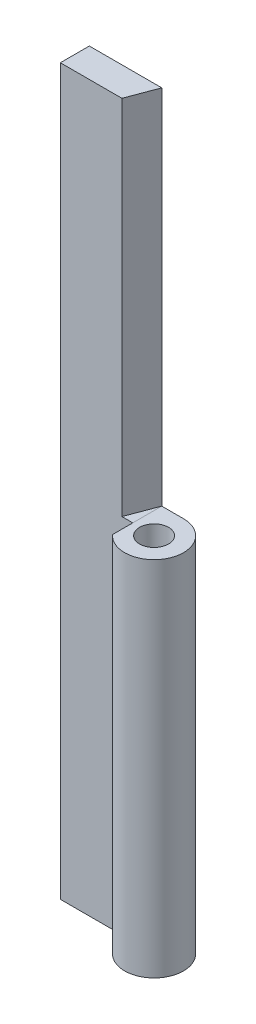
ISO-10303-21;
HEADER;
FILE_DESCRIPTION(('STEP AP214'),'2;1');
FILE_NAME('part.step','',(''),(''),'','','');
FILE_SCHEMA(('AUTOMOTIVE_DESIGN { 1 0 10303 214 1 1 1 1 }'));
ENDSEC;
DATA;
#1=APPLICATION_CONTEXT('core data for automotive mechanical design processes');
#2=APPLICATION_PROTOCOL_DEFINITION('international standard','automotive_design',2000,#1);
#3=PRODUCT_CONTEXT('',#1,'mechanical');
#4=PRODUCT('Part','Part','',(#3));
#5=PRODUCT_RELATED_PRODUCT_CATEGORY('part','',(#4));
#6=PRODUCT_DEFINITION_FORMATION('','',#4);
#7=PRODUCT_DEFINITION_CONTEXT('part definition',#1,'design');
#8=PRODUCT_DEFINITION('design','',#6,#7);
#9=PRODUCT_DEFINITION_SHAPE('','',#8);
#10=(LENGTH_UNIT() NAMED_UNIT(*) SI_UNIT(.MILLI.,.METRE.));
#11=(NAMED_UNIT(*) PLANE_ANGLE_UNIT() SI_UNIT($,.RADIAN.));
#12=(NAMED_UNIT(*) SI_UNIT($,.STERADIAN.) SOLID_ANGLE_UNIT());
#13=UNCERTAINTY_MEASURE_WITH_UNIT(LENGTH_MEASURE(1.E-05),#10,'distance_accuracy_value','');
#14=(GEOMETRIC_REPRESENTATION_CONTEXT(3) GLOBAL_UNCERTAINTY_ASSIGNED_CONTEXT((#13)) GLOBAL_UNIT_ASSIGNED_CONTEXT((#10,
#11,#12)) REPRESENTATION_CONTEXT('',''));
#15=CARTESIAN_POINT('',(0.,0.,0.));
#16=DIRECTION('',(0.,0.,1.));
#17=DIRECTION('',(1.,0.,0.));
#18=AXIS2_PLACEMENT_3D('',#15,#16,#17);
#19=CARTESIAN_POINT('',(5.,-25.,3.4));
#20=DIRECTION('',(-1.,0.,0.));
#21=DIRECTION('',(0.,0.,1.));
#22=AXIS2_PLACEMENT_3D('',#19,#20,#21);
#23=PLANE('',#22);
#24=DIRECTION('',(0.,0.,-1.));
#25=VECTOR('',#24,1.);
#26=CARTESIAN_POINT('',(5.,-50.,3.4));
#27=LINE('',#26,#25);
#28=CARTESIAN_POINT('',(5.,-50.,3.4));
#29=VERTEX_POINT('',#28);
#30=CARTESIAN_POINT('',(5.,-50.,0.));
#31=VERTEX_POINT('',#30);
#32=EDGE_CURVE('E104',#29,#31,#27,.T.);
#33=ORIENTED_EDGE('',*,*,#32,.F.);
#34=DIRECTION('',(0.,-1.,0.));
#35=VECTOR('',#34,1.);
#36=CARTESIAN_POINT('',(5.,-25.,3.4));
#37=LINE('',#36,#35);
#38=CARTESIAN_POINT('',(5.,-25.,3.4));
#39=VERTEX_POINT('',#38);
#40=EDGE_CURVE('E12',#39,#29,#37,.T.);
#41=ORIENTED_EDGE('',*,*,#40,.F.);
#42=DIRECTION('',(0.,0.,-1.));
#43=VECTOR('',#42,1.);
#44=CARTESIAN_POINT('',(5.,-25.,3.4));
#45=LINE('',#44,#43);
#46=CARTESIAN_POINT('',(5.,-25.,0.));
#47=VERTEX_POINT('',#46);
#48=EDGE_CURVE('E93',#39,#47,#45,.T.);
#49=ORIENTED_EDGE('',*,*,#48,.T.);
#50=DIRECTION('',(0.,-1.,0.));
#51=VECTOR('',#50,1.);
#52=CARTESIAN_POINT('',(5.,-25.,0.));
#53=LINE('',#52,#51);
#54=EDGE_CURVE('E52',#47,#31,#53,.T.);
#55=ORIENTED_EDGE('',*,*,#54,.T.);
#56=EDGE_LOOP('',(#33,#41,#49,#55));
#57=FACE_BOUND('',#56,.T.);
#58=ADVANCED_FACE('F49',(#57),#23,.T.);
#59=CARTESIAN_POINT('',(6.5,-25.,2.03088235294118));
#60=DIRECTION('',(0.,-1.,0.));
#61=DIRECTION('',(0.,0.,-1.));
#62=AXIS2_PLACEMENT_3D('',#59,#60,#61);
#63=CYLINDRICAL_SURFACE('',#62,2.03088235294118);
#64=CARTESIAN_POINT('',(6.5,-50.,2.03088235294118));
#65=DIRECTION('',(0.,-1.,0.));
#66=DIRECTION('',(0.,0.,-1.));
#67=AXIS2_PLACEMENT_3D('',#64,#65,#66);
#68=CIRCLE('',#67,2.03088235294118);
#69=CARTESIAN_POINT('',(6.5,-50.,0.));
#70=VERTEX_POINT('',#69);
#71=EDGE_CURVE('E95',#70,#29,#68,.T.);
#72=ORIENTED_EDGE('',*,*,#71,.F.);
#73=DIRECTION('',(0.,-1.,0.));
#74=VECTOR('',#73,1.);
#75=CARTESIAN_POINT('',(6.5,-25.,0.));
#76=LINE('',#75,#74);
#77=CARTESIAN_POINT('',(6.5,-25.,0.));
#78=VERTEX_POINT('',#77);
#79=EDGE_CURVE('E58',#78,#70,#76,.T.);
#80=ORIENTED_EDGE('',*,*,#79,.F.);
#81=CARTESIAN_POINT('',(6.5,-25.,2.03088235294118));
#82=DIRECTION('',(0.,-1.,0.));
#83=DIRECTION('',(0.,0.,-1.));
#84=AXIS2_PLACEMENT_3D('',#81,#82,#83);
#85=CIRCLE('',#84,2.03088235294118);
#86=EDGE_CURVE('E90',#78,#39,#85,.T.);
#87=ORIENTED_EDGE('',*,*,#86,.T.);
#88=ORIENTED_EDGE('',*,*,#40,.T.);
#89=EDGE_LOOP('',(#72,#80,#87,#88));
#90=FACE_BOUND('',#89,.T.);
#91=ADVANCED_FACE('F108',(#90),#63,.T.);
#92=CARTESIAN_POINT('',(5.,-25.,0.));
#93=DIRECTION('',(0.,0.,-1.));
#94=DIRECTION('',(-1.,0.,0.));
#95=AXIS2_PLACEMENT_3D('',#92,#93,#94);
#96=PLANE('',#95);
#97=DIRECTION('',(1.,0.,0.));
#98=VECTOR('',#97,1.);
#99=CARTESIAN_POINT('',(5.,-50.,0.));
#100=LINE('',#99,#98);
#101=EDGE_CURVE('E88',#31,#70,#100,.T.);
#102=ORIENTED_EDGE('',*,*,#101,.F.);
#103=ORIENTED_EDGE('',*,*,#54,.F.);
#104=DIRECTION('',(1.,0.,0.));
#105=VECTOR('',#104,1.);
#106=CARTESIAN_POINT('',(5.,-25.,0.));
#107=LINE('',#106,#105);
#108=EDGE_CURVE('E86',#47,#78,#107,.T.);
#109=ORIENTED_EDGE('',*,*,#108,.T.);
#110=ORIENTED_EDGE('',*,*,#79,.T.);
#111=EDGE_LOOP('',(#102,#103,#109,#110));
#112=FACE_BOUND('',#111,.T.);
#113=ADVANCED_FACE('F85',(#112),#96,.T.);
#114=CARTESIAN_POINT('',(6.5,-25.,2.03088235294118));
#115=DIRECTION('',(0.,-1.,0.));
#116=DIRECTION('',(0.,0.,-1.));
#117=AXIS2_PLACEMENT_3D('',#114,#115,#116);
#118=PLANE('',#117);
#119=CARTESIAN_POINT('',(6.5,-25.,2.03088235294118));
#120=DIRECTION('',(0.,-1.,0.));
#121=DIRECTION('',(0.,0.,-1.));
#122=AXIS2_PLACEMENT_3D('',#119,#120,#121);
#123=CIRCLE('',#122,1.);
#124=CARTESIAN_POINT('',(6.5,-25.,1.03088235294117));
#125=VERTEX_POINT('',#124);
#126=EDGE_CURVE('E100',#125,#125,#123,.T.);
#127=ORIENTED_EDGE('',*,*,#126,.T.);
#128=EDGE_LOOP('',(#127));
#129=FACE_BOUND('',#128,.T.);
#130=ORIENTED_EDGE('',*,*,#48,.F.);
#131=ORIENTED_EDGE('',*,*,#86,.F.);
#132=ORIENTED_EDGE('',*,*,#108,.F.);
#133=EDGE_LOOP('',(#130,#131,#132));
#134=FACE_BOUND('',#133,.T.);
#135=ADVANCED_FACE('F92',(#129,#134),#118,.F.);
#136=CARTESIAN_POINT('',(6.5,-50.,2.03088235294118));
#137=DIRECTION('',(0.,-1.,0.));
#138=DIRECTION('',(0.,0.,-1.));
#139=AXIS2_PLACEMENT_3D('',#136,#137,#138);
#140=PLANE('',#139);
#141=CARTESIAN_POINT('',(6.5,-50.,2.03088235294118));
#142=DIRECTION('',(0.,-1.,0.));
#143=DIRECTION('',(0.,0.,-1.));
#144=AXIS2_PLACEMENT_3D('',#141,#142,#143);
#145=CIRCLE('',#144,1.);
#146=CARTESIAN_POINT('',(6.5,-50.,1.03088235294117));
#147=VERTEX_POINT('',#146);
#148=EDGE_CURVE('E130',#147,#147,#145,.T.);
#149=ORIENTED_EDGE('',*,*,#148,.F.);
#150=EDGE_LOOP('',(#149));
#151=FACE_BOUND('',#150,.T.);
#152=ORIENTED_EDGE('',*,*,#32,.T.);
#153=ORIENTED_EDGE('',*,*,#101,.T.);
#154=ORIENTED_EDGE('',*,*,#71,.T.);
#155=EDGE_LOOP('',(#152,#153,#154));
#156=FACE_BOUND('',#155,.T.);
#157=ADVANCED_FACE('F107',(#151,#156),#140,.T.);
#158=CARTESIAN_POINT('',(6.5,0.,2.03088235294118));
#159=DIRECTION('',(0.,-1.,0.));
#160=DIRECTION('',(0.,0.,-1.));
#161=AXIS2_PLACEMENT_3D('',#158,#159,#160);
#162=CYLINDRICAL_SURFACE('',#161,1.);
#163=ORIENTED_EDGE('',*,*,#148,.T.);
#164=EDGE_LOOP('',(#163));
#165=FACE_BOUND('',#164,.T.);
#166=ORIENTED_EDGE('',*,*,#126,.F.);
#167=EDGE_LOOP('',(#166));
#168=FACE_BOUND('',#167,.T.);
#169=ADVANCED_FACE('F118',(#165,#168),#162,.F.);
#170=CLOSED_SHELL('',(#58,#91,#113,#135,#157,#169));
#171=MANIFOLD_SOLID_BREP('B2',#170);
#172=CARTESIAN_POINT('',(0.,0.,2.));
#173=DIRECTION('',(1.,0.,0.));
#174=DIRECTION('',(0.,1.,0.));
#175=AXIS2_PLACEMENT_3D('',#172,#173,#174);
#176=PLANE('',#175);
#177=DIRECTION('',(0.,-1.,0.));
#178=VECTOR('',#177,1.);
#179=CARTESIAN_POINT('',(0.,0.,0.));
#180=LINE('',#179,#178);
#181=CARTESIAN_POINT('',(0.,0.,0.));
#182=VERTEX_POINT('',#181);
#183=CARTESIAN_POINT('',(0.,-50.,0.));
#184=VERTEX_POINT('',#183);
#185=EDGE_CURVE('E253',#182,#184,#180,.T.);
#186=ORIENTED_EDGE('',*,*,#185,.T.);
#187=DIRECTION('',(0.,0.,-1.));
#188=VECTOR('',#187,1.);
#189=CARTESIAN_POINT('',(0.,-50.,2.));
#190=LINE('',#189,#188);
#191=CARTESIAN_POINT('',(0.,-50.,2.));
#192=VERTEX_POINT('',#191);
#193=EDGE_CURVE('E47',#192,#184,#190,.T.);
#194=ORIENTED_EDGE('',*,*,#193,.F.);
#195=DIRECTION('',(0.,-1.,0.));
#196=VECTOR('',#195,1.);
#197=CARTESIAN_POINT('',(0.,0.,2.));
#198=LINE('',#197,#196);
#199=CARTESIAN_POINT('',(0.,0.,2.));
#200=VERTEX_POINT('',#199);
#201=EDGE_CURVE('E265',#200,#192,#198,.T.);
#202=ORIENTED_EDGE('',*,*,#201,.F.);
#203=DIRECTION('',(0.,0.,-1.));
#204=VECTOR('',#203,1.);
#205=CARTESIAN_POINT('',(0.,0.,2.));
#206=LINE('',#205,#204);
#207=EDGE_CURVE('E242',#200,#182,#206,.T.);
#208=ORIENTED_EDGE('',*,*,#207,.T.);
#209=EDGE_LOOP('',(#186,#194,#202,#208));
#210=FACE_BOUND('',#209,.T.);
#211=ADVANCED_FACE('F168',(#210),#176,.F.);
#212=CARTESIAN_POINT('',(0.,-50.,2.));
#213=DIRECTION('',(0.,1.,0.));
#214=DIRECTION('',(0.,0.,1.));
#215=AXIS2_PLACEMENT_3D('',#212,#213,#214);
#216=PLANE('',#215);
#217=DIRECTION('',(1.,0.,0.));
#218=VECTOR('',#217,1.);
#219=CARTESIAN_POINT('',(0.,-50.,0.));
#220=LINE('',#219,#218);
#221=CARTESIAN_POINT('',(5.00000000000001,-50.,0.));
#222=VERTEX_POINT('',#221);
#223=EDGE_CURVE('E257',#184,#222,#220,.T.);
#224=ORIENTED_EDGE('',*,*,#223,.T.);
#225=DIRECTION('',(0.,0.,-1.));
#226=VECTOR('',#225,1.);
#227=CARTESIAN_POINT('',(5.00000000000001,-50.,2.));
#228=LINE('',#227,#226);
#229=CARTESIAN_POINT('',(5.00000000000001,-50.,2.));
#230=VERTEX_POINT('',#229);
#231=EDGE_CURVE('E176',#230,#222,#228,.T.);
#232=ORIENTED_EDGE('',*,*,#231,.F.);
#233=DIRECTION('',(1.,0.,0.));
#234=VECTOR('',#233,1.);
#235=CARTESIAN_POINT('',(0.,-50.,2.));
#236=LINE('',#235,#234);
#237=EDGE_CURVE('E215',#192,#230,#236,.T.);
#238=ORIENTED_EDGE('',*,*,#237,.F.);
#239=ORIENTED_EDGE('',*,*,#193,.T.);
#240=EDGE_LOOP('',(#224,#232,#238,#239));
#241=FACE_BOUND('',#240,.T.);
#242=ADVANCED_FACE('F286',(#241),#216,.F.);
#243=CARTESIAN_POINT('',(5.,0.,2.));
#244=DIRECTION('',(-1.,0.,0.));
#245=DIRECTION('',(0.,-1.,0.));
#246=AXIS2_PLACEMENT_3D('',#243,#244,#245);
#247=PLANE('',#246);
#248=DIRECTION('',(0.,1.,0.));
#249=VECTOR('',#248,1.);
#250=CARTESIAN_POINT('',(5.,0.,0.));
#251=LINE('',#250,#249);
#252=CARTESIAN_POINT('',(5.,-25.,0.));
#253=VERTEX_POINT('',#252);
#254=EDGE_CURVE('E260',#222,#253,#251,.T.);
#255=ORIENTED_EDGE('',*,*,#254,.T.);
#256=DIRECTION('',(0.,0.,-1.));
#257=VECTOR('',#256,1.);
#258=CARTESIAN_POINT('',(5.,-25.,2.));
#259=LINE('',#258,#257);
#260=CARTESIAN_POINT('',(5.,-25.,2.));
#261=VERTEX_POINT('',#260);
#262=EDGE_CURVE('E183',#261,#253,#259,.T.);
#263=ORIENTED_EDGE('',*,*,#262,.F.);
#264=DIRECTION('',(0.,1.,0.));
#265=VECTOR('',#264,1.);
#266=CARTESIAN_POINT('',(5.,0.,2.));
#267=LINE('',#266,#265);
#268=EDGE_CURVE('E245',#230,#261,#267,.T.);
#269=ORIENTED_EDGE('',*,*,#268,.F.);
#270=ORIENTED_EDGE('',*,*,#231,.T.);
#271=EDGE_LOOP('',(#255,#263,#269,#270));
#272=FACE_BOUND('',#271,.T.);
#273=ADVANCED_FACE('F271',(#272),#247,.F.);
#274=CARTESIAN_POINT('',(0.,0.,2.));
#275=DIRECTION('',(0.,-1.,0.));
#276=DIRECTION('',(0.,0.,-1.));
#277=AXIS2_PLACEMENT_3D('',#274,#275,#276);
#278=PLANE('',#277);
#279=DIRECTION('',(-1.,0.,0.));
#280=VECTOR('',#279,1.);
#281=CARTESIAN_POINT('',(0.,0.,2.));
#282=LINE('',#281,#280);
#283=CARTESIAN_POINT('',(4.25,0.,2.));
#284=VERTEX_POINT('',#283);
#285=EDGE_CURVE('E192',#284,#200,#282,.T.);
#286=ORIENTED_EDGE('',*,*,#285,.F.);
#287=DIRECTION('',(-0.351123441588392,0.,0.936329177569045));
#288=VECTOR('',#287,1.);
#289=CARTESIAN_POINT('',(5.,0.,0.));
#290=LINE('',#289,#288);
#291=CARTESIAN_POINT('',(5.,0.,0.));
#292=VERTEX_POINT('',#291);
#293=EDGE_CURVE('E227',#292,#284,#290,.T.);
#294=ORIENTED_EDGE('',*,*,#293,.F.);
#295=DIRECTION('',(-1.,0.,0.));
#296=VECTOR('',#295,1.);
#297=CARTESIAN_POINT('',(0.,0.,0.));
#298=LINE('',#297,#296);
#299=EDGE_CURVE('E210',#292,#182,#298,.T.);
#300=ORIENTED_EDGE('',*,*,#299,.T.);
#301=ORIENTED_EDGE('',*,*,#207,.F.);
#302=EDGE_LOOP('',(#286,#294,#300,#301));
#303=FACE_BOUND('',#302,.T.);
#304=ADVANCED_FACE('F241',(#303),#278,.F.);
#305=CARTESIAN_POINT('',(0.,0.,2.));
#306=DIRECTION('',(0.,0.,1.));
#307=DIRECTION('',(1.,0.,0.));
#308=AXIS2_PLACEMENT_3D('',#305,#306,#307);
#309=PLANE('',#308);
#310=DIRECTION('',(1.,0.,0.));
#311=VECTOR('',#310,1.);
#312=CARTESIAN_POINT('',(4.25,-25.,2.));
#313=LINE('',#312,#311);
#314=CARTESIAN_POINT('',(4.25,-25.,2.));
#315=VERTEX_POINT('',#314);
#316=EDGE_CURVE('E237',#315,#261,#313,.T.);
#317=ORIENTED_EDGE('',*,*,#316,.F.);
#318=DIRECTION('',(0.,1.,0.));
#319=VECTOR('',#318,1.);
#320=CARTESIAN_POINT('',(4.25,-27.1360009363294,2.));
#321=LINE('',#320,#319);
#322=EDGE_CURVE('E229',#315,#284,#321,.T.);
#323=ORIENTED_EDGE('',*,*,#322,.T.);
#324=ORIENTED_EDGE('',*,*,#285,.T.);
#325=ORIENTED_EDGE('',*,*,#201,.T.);
#326=ORIENTED_EDGE('',*,*,#237,.T.);
#327=ORIENTED_EDGE('',*,*,#268,.T.);
#328=EDGE_LOOP('',(#317,#323,#324,#325,#326,#327));
#329=FACE_BOUND('',#328,.T.);
#330=ADVANCED_FACE('F235',(#329),#309,.T.);
#331=CARTESIAN_POINT('',(0.,0.,0.));
#332=DIRECTION('',(0.,0.,1.));
#333=DIRECTION('',(1.,0.,0.));
#334=AXIS2_PLACEMENT_3D('',#331,#332,#333);
#335=PLANE('',#334);
#336=ORIENTED_EDGE('',*,*,#185,.F.);
#337=ORIENTED_EDGE('',*,*,#299,.F.);
#338=DIRECTION('',(0.,1.,0.));
#339=VECTOR('',#338,1.);
#340=CARTESIAN_POINT('',(5.,-27.1360009363294,0.));
#341=LINE('',#340,#339);
#342=EDGE_CURVE('E231',#253,#292,#341,.T.);
#343=ORIENTED_EDGE('',*,*,#342,.F.);
#344=ORIENTED_EDGE('',*,*,#254,.F.);
#345=ORIENTED_EDGE('',*,*,#223,.F.);
#346=EDGE_LOOP('',(#336,#337,#343,#344,#345));
#347=FACE_BOUND('',#346,.T.);
#348=ADVANCED_FACE('F274',(#347),#335,.F.);
#349=CARTESIAN_POINT('',(6.5,-25.,2.03088235294118));
#350=DIRECTION('',(0.,-1.,0.));
#351=DIRECTION('',(0.,0.,-1.));
#352=AXIS2_PLACEMENT_3D('',#349,#350,#351);
#353=PLANE('',#352);
#354=ORIENTED_EDGE('',*,*,#316,.T.);
#355=ORIENTED_EDGE('',*,*,#262,.T.);
#356=DIRECTION('',(-0.351123441588392,0.,0.936329177569045));
#357=VECTOR('',#356,1.);
#358=CARTESIAN_POINT('',(5.,-25.,0.));
#359=LINE('',#358,#357);
#360=EDGE_CURVE('E239',#253,#315,#359,.T.);
#361=ORIENTED_EDGE('',*,*,#360,.T.);
#362=EDGE_LOOP('',(#354,#355,#361));
#363=FACE_BOUND('',#362,.T.);
#364=ADVANCED_FACE('F298',(#363),#353,.F.);
#365=CARTESIAN_POINT('',(5.,-27.1360009363294,0.));
#366=DIRECTION('',(-0.936329177569044,0.,-0.351123441588392));
#367=DIRECTION('',(-0.351123441588392,0.,0.936329177569045));
#368=AXIS2_PLACEMENT_3D('',#365,#366,#367);
#369=PLANE('',#368);
#370=ORIENTED_EDGE('',*,*,#342,.T.);
#371=ORIENTED_EDGE('',*,*,#293,.T.);
#372=ORIENTED_EDGE('',*,*,#322,.F.);
#373=ORIENTED_EDGE('',*,*,#360,.F.);
#374=EDGE_LOOP('',(#370,#371,#372,#373));
#375=FACE_BOUND('',#374,.T.);
#376=ADVANCED_FACE('F228',(#375),#369,.F.);
#377=CLOSED_SHELL('',(#211,#242,#273,#304,#330,#348,#364,#376));
#378=MANIFOLD_SOLID_BREP('B6',#377);
#379=ADVANCED_BREP_SHAPE_REPRESENTATION('',(#18,#171,#378),#14);
#380=SHAPE_DEFINITION_REPRESENTATION(#9,#379);
ENDSEC;
END-ISO-10303-21;
